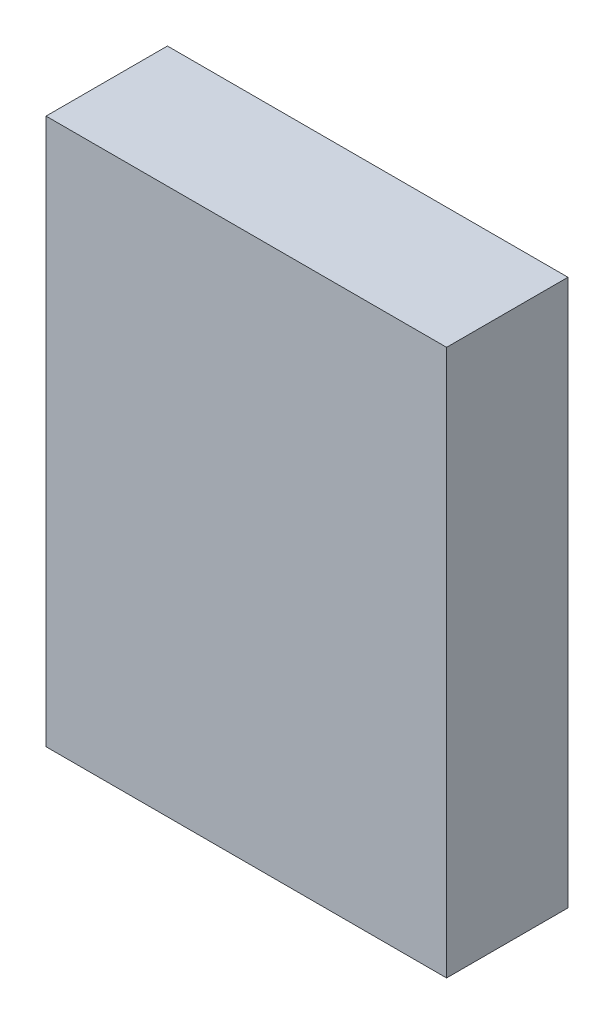
ISO-10303-21;
HEADER;
FILE_DESCRIPTION(('STEP AP214'),'2;1');
FILE_NAME('part.step','',(''),(''),'','','');
FILE_SCHEMA(('AUTOMOTIVE_DESIGN { 1 0 10303 214 1 1 1 1 }'));
ENDSEC;
DATA;
#1=APPLICATION_CONTEXT('core data for automotive mechanical design processes');
#2=APPLICATION_PROTOCOL_DEFINITION('international standard','automotive_design',2000,#1);
#3=PRODUCT_CONTEXT('',#1,'mechanical');
#4=PRODUCT('Part','Part','',(#3));
#5=PRODUCT_RELATED_PRODUCT_CATEGORY('part','',(#4));
#6=PRODUCT_DEFINITION_FORMATION('','',#4);
#7=PRODUCT_DEFINITION_CONTEXT('part definition',#1,'design');
#8=PRODUCT_DEFINITION('design','',#6,#7);
#9=PRODUCT_DEFINITION_SHAPE('','',#8);
#10=(LENGTH_UNIT() NAMED_UNIT(*) SI_UNIT(.MILLI.,.METRE.));
#11=(NAMED_UNIT(*) PLANE_ANGLE_UNIT() SI_UNIT($,.RADIAN.));
#12=(NAMED_UNIT(*) SI_UNIT($,.STERADIAN.) SOLID_ANGLE_UNIT());
#13=UNCERTAINTY_MEASURE_WITH_UNIT(LENGTH_MEASURE(1.E-05),#10,'distance_accuracy_value','');
#14=(GEOMETRIC_REPRESENTATION_CONTEXT(3) GLOBAL_UNCERTAINTY_ASSIGNED_CONTEXT((#13)) GLOBAL_UNIT_ASSIGNED_CONTEXT((#10,
#11,#12)) REPRESENTATION_CONTEXT('',''));
#15=CARTESIAN_POINT('',(0.,0.,0.));
#16=DIRECTION('',(0.,0.,1.));
#17=DIRECTION('',(1.,0.,0.));
#18=AXIS2_PLACEMENT_3D('',#15,#16,#17);
#19=CARTESIAN_POINT('',(330.,-450.,200.));
#20=DIRECTION('',(-1.,0.,0.));
#21=DIRECTION('',(0.,0.,1.));
#22=AXIS2_PLACEMENT_3D('',#19,#20,#21);
#23=PLANE('',#22);
#24=DIRECTION('',(0.,1.,0.));
#25=VECTOR('',#24,1.);
#26=CARTESIAN_POINT('',(330.,-450.,0.));
#27=LINE('',#26,#25);
#28=CARTESIAN_POINT('',(330.,-450.,0.));
#29=VERTEX_POINT('',#28);
#30=CARTESIAN_POINT('',(330.,450.,0.));
#31=VERTEX_POINT('',#30);
#32=EDGE_CURVE('E96',#29,#31,#27,.T.);
#33=ORIENTED_EDGE('',*,*,#32,.T.);
#34=DIRECTION('',(0.,0.,-1.));
#35=VECTOR('',#34,1.);
#36=CARTESIAN_POINT('',(330.,450.,200.));
#37=LINE('',#36,#35);
#38=CARTESIAN_POINT('',(330.,450.,200.));
#39=VERTEX_POINT('',#38);
#40=EDGE_CURVE('E11',#39,#31,#37,.T.);
#41=ORIENTED_EDGE('',*,*,#40,.F.);
#42=DIRECTION('',(0.,1.,0.));
#43=VECTOR('',#42,1.);
#44=CARTESIAN_POINT('',(330.,-450.,200.));
#45=LINE('',#44,#43);
#46=CARTESIAN_POINT('',(330.,-450.,200.));
#47=VERTEX_POINT('',#46);
#48=EDGE_CURVE('E84',#47,#39,#45,.T.);
#49=ORIENTED_EDGE('',*,*,#48,.F.);
#50=DIRECTION('',(0.,0.,-1.));
#51=VECTOR('',#50,1.);
#52=CARTESIAN_POINT('',(330.,-450.,200.));
#53=LINE('',#52,#51);
#54=EDGE_CURVE('E92',#47,#29,#53,.T.);
#55=ORIENTED_EDGE('',*,*,#54,.T.);
#56=EDGE_LOOP('',(#33,#41,#49,#55));
#57=FACE_BOUND('',#56,.T.);
#58=ADVANCED_FACE('F33',(#57),#23,.F.);
#59=CARTESIAN_POINT('',(-330.,450.,200.));
#60=DIRECTION('',(0.,-1.,0.));
#61=DIRECTION('',(0.,0.,-1.));
#62=AXIS2_PLACEMENT_3D('',#59,#60,#61);
#63=PLANE('',#62);
#64=DIRECTION('',(-1.,0.,0.));
#65=VECTOR('',#64,1.);
#66=CARTESIAN_POINT('',(-330.,450.,0.));
#67=LINE('',#66,#65);
#68=CARTESIAN_POINT('',(-330.,450.,0.));
#69=VERTEX_POINT('',#68);
#70=EDGE_CURVE('E88',#31,#69,#67,.T.);
#71=ORIENTED_EDGE('',*,*,#70,.T.);
#72=DIRECTION('',(0.,0.,-1.));
#73=VECTOR('',#72,1.);
#74=CARTESIAN_POINT('',(-330.,450.,200.));
#75=LINE('',#74,#73);
#76=CARTESIAN_POINT('',(-330.,450.,200.));
#77=VERTEX_POINT('',#76);
#78=EDGE_CURVE('E41',#77,#69,#75,.T.);
#79=ORIENTED_EDGE('',*,*,#78,.F.);
#80=DIRECTION('',(-1.,0.,0.));
#81=VECTOR('',#80,1.);
#82=CARTESIAN_POINT('',(-330.,450.,200.));
#83=LINE('',#82,#81);
#84=EDGE_CURVE('E79',#39,#77,#83,.T.);
#85=ORIENTED_EDGE('',*,*,#84,.F.);
#86=ORIENTED_EDGE('',*,*,#40,.T.);
#87=EDGE_LOOP('',(#71,#79,#85,#86));
#88=FACE_BOUND('',#87,.T.);
#89=ADVANCED_FACE('F87',(#88),#63,.F.);
#90=CARTESIAN_POINT('',(-330.,-450.,200.));
#91=DIRECTION('',(1.,0.,0.));
#92=DIRECTION('',(0.,0.,-1.));
#93=AXIS2_PLACEMENT_3D('',#90,#91,#92);
#94=PLANE('',#93);
#95=DIRECTION('',(0.,-1.,0.));
#96=VECTOR('',#95,1.);
#97=CARTESIAN_POINT('',(-330.,-450.,0.));
#98=LINE('',#97,#96);
#99=CARTESIAN_POINT('',(-330.,-450.,0.));
#100=VERTEX_POINT('',#99);
#101=EDGE_CURVE('E66',#69,#100,#98,.T.);
#102=ORIENTED_EDGE('',*,*,#101,.T.);
#103=DIRECTION('',(0.,0.,-1.));
#104=VECTOR('',#103,1.);
#105=CARTESIAN_POINT('',(-330.,-450.,200.));
#106=LINE('',#105,#104);
#107=CARTESIAN_POINT('',(-330.,-450.,200.));
#108=VERTEX_POINT('',#107);
#109=EDGE_CURVE('E89',#108,#100,#106,.T.);
#110=ORIENTED_EDGE('',*,*,#109,.F.);
#111=DIRECTION('',(0.,-1.,0.));
#112=VECTOR('',#111,1.);
#113=CARTESIAN_POINT('',(-330.,-450.,200.));
#114=LINE('',#113,#112);
#115=EDGE_CURVE('E82',#77,#108,#114,.T.);
#116=ORIENTED_EDGE('',*,*,#115,.F.);
#117=ORIENTED_EDGE('',*,*,#78,.T.);
#118=EDGE_LOOP('',(#102,#110,#116,#117));
#119=FACE_BOUND('',#118,.T.);
#120=ADVANCED_FACE('F90',(#119),#94,.F.);
#121=CARTESIAN_POINT('',(-330.,-450.,200.));
#122=DIRECTION('',(0.,1.,0.));
#123=DIRECTION('',(0.,0.,1.));
#124=AXIS2_PLACEMENT_3D('',#121,#122,#123);
#125=PLANE('',#124);
#126=DIRECTION('',(1.,0.,0.));
#127=VECTOR('',#126,1.);
#128=CARTESIAN_POINT('',(-330.,-450.,0.));
#129=LINE('',#128,#127);
#130=EDGE_CURVE('E72',#100,#29,#129,.T.);
#131=ORIENTED_EDGE('',*,*,#130,.T.);
#132=ORIENTED_EDGE('',*,*,#54,.F.);
#133=DIRECTION('',(1.,0.,0.));
#134=VECTOR('',#133,1.);
#135=CARTESIAN_POINT('',(-330.,-450.,200.));
#136=LINE('',#135,#134);
#137=EDGE_CURVE('E49',#108,#47,#136,.T.);
#138=ORIENTED_EDGE('',*,*,#137,.F.);
#139=ORIENTED_EDGE('',*,*,#109,.T.);
#140=EDGE_LOOP('',(#131,#132,#138,#139));
#141=FACE_BOUND('',#140,.T.);
#142=ADVANCED_FACE('F103',(#141),#125,.F.);
#143=CARTESIAN_POINT('',(0.,0.,200.));
#144=DIRECTION('',(0.,0.,-1.));
#145=DIRECTION('',(-1.,0.,0.));
#146=AXIS2_PLACEMENT_3D('',#143,#144,#145);
#147=PLANE('',#146);
#148=ORIENTED_EDGE('',*,*,#48,.T.);
#149=ORIENTED_EDGE('',*,*,#84,.T.);
#150=ORIENTED_EDGE('',*,*,#115,.T.);
#151=ORIENTED_EDGE('',*,*,#137,.T.);
#152=EDGE_LOOP('',(#148,#149,#150,#151));
#153=FACE_BOUND('',#152,.T.);
#154=ADVANCED_FACE('F80',(#153),#147,.F.);
#155=CARTESIAN_POINT('',(0.,0.,0.));
#156=DIRECTION('',(0.,0.,-1.));
#157=DIRECTION('',(-1.,0.,0.));
#158=AXIS2_PLACEMENT_3D('',#155,#156,#157);
#159=PLANE('',#158);
#160=ORIENTED_EDGE('',*,*,#32,.F.);
#161=ORIENTED_EDGE('',*,*,#130,.F.);
#162=ORIENTED_EDGE('',*,*,#101,.F.);
#163=ORIENTED_EDGE('',*,*,#70,.F.);
#164=EDGE_LOOP('',(#160,#161,#162,#163));
#165=FACE_BOUND('',#164,.T.);
#166=ADVANCED_FACE('F106',(#165),#159,.T.);
#167=CLOSED_SHELL('',(#58,#89,#120,#142,#154,#166));
#168=MANIFOLD_SOLID_BREP('B2',#167);
#169=ADVANCED_BREP_SHAPE_REPRESENTATION('',(#18,#168),#14);
#170=SHAPE_DEFINITION_REPRESENTATION(#9,#169);
ENDSEC;
END-ISO-10303-21;
